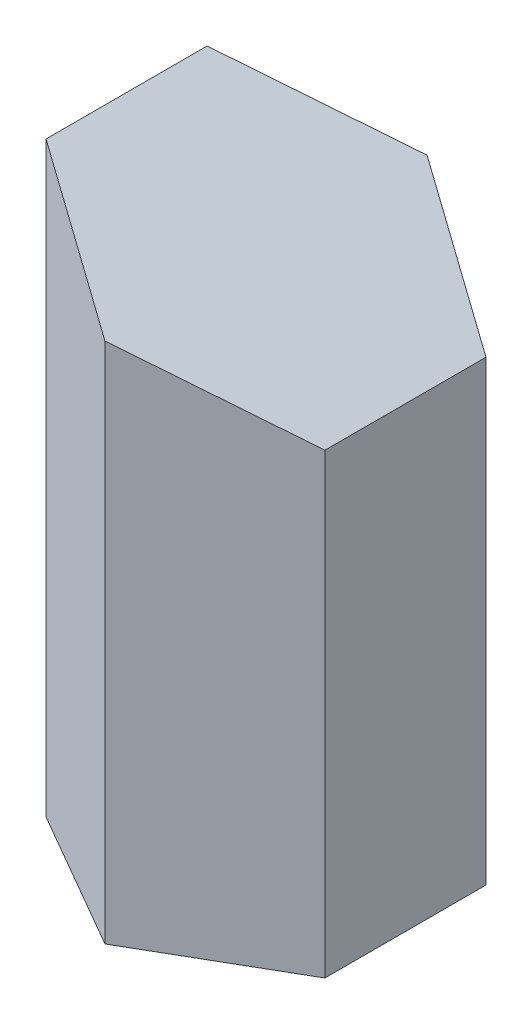
ISO-10303-21;
HEADER;
FILE_DESCRIPTION(('STEP AP214'),'2;1');
FILE_NAME('part.step','',(''),(''),'','','');
FILE_SCHEMA(('AUTOMOTIVE_DESIGN { 1 0 10303 214 1 1 1 1 }'));
ENDSEC;
DATA;
#1=APPLICATION_CONTEXT('core data for automotive mechanical design processes');
#2=APPLICATION_PROTOCOL_DEFINITION('international standard','automotive_design',2000,#1);
#3=PRODUCT_CONTEXT('',#1,'mechanical');
#4=PRODUCT('Part','Part','',(#3));
#5=PRODUCT_RELATED_PRODUCT_CATEGORY('part','',(#4));
#6=PRODUCT_DEFINITION_FORMATION('','',#4);
#7=PRODUCT_DEFINITION_CONTEXT('part definition',#1,'design');
#8=PRODUCT_DEFINITION('design','',#6,#7);
#9=PRODUCT_DEFINITION_SHAPE('','',#8);
#10=(LENGTH_UNIT() NAMED_UNIT(*) SI_UNIT(.MILLI.,.METRE.));
#11=(NAMED_UNIT(*) PLANE_ANGLE_UNIT() SI_UNIT($,.RADIAN.));
#12=(NAMED_UNIT(*) SI_UNIT($,.STERADIAN.) SOLID_ANGLE_UNIT());
#13=UNCERTAINTY_MEASURE_WITH_UNIT(LENGTH_MEASURE(1.E-05),#10,'distance_accuracy_value','');
#14=(GEOMETRIC_REPRESENTATION_CONTEXT(3) GLOBAL_UNCERTAINTY_ASSIGNED_CONTEXT((#13)) GLOBAL_UNIT_ASSIGNED_CONTEXT((#10,
#11,#12)) REPRESENTATION_CONTEXT('',''));
#15=CARTESIAN_POINT('',(0.,0.,0.));
#16=DIRECTION('',(0.,0.,1.));
#17=DIRECTION('',(1.,0.,0.));
#18=AXIS2_PLACEMENT_3D('',#15,#16,#17);
#19=CARTESIAN_POINT('',(-9.49999999999994,40.,5.48482755730156));
#20=DIRECTION('',(0.499999999999995,0.,-0.866025403784442));
#21=DIRECTION('',(-0.866025403784442,0.,-0.499999999999995));
#22=AXIS2_PLACEMENT_3D('',#19,#20,#21);
#23=PLANE('',#22);
#24=DIRECTION('',(0.,-1.,0.));
#25=VECTOR('',#24,1.);
#26=CARTESIAN_POINT('',(0.,40.,10.9696551146029));
#27=LINE('',#26,#25);
#28=CARTESIAN_POINT('',(0.,35.5700772475275,10.9696551146029));
#29=VERTEX_POINT('',#28);
#30=CARTESIAN_POINT('',(0.,0.,10.9696551146029));
#31=VERTEX_POINT('',#30);
#32=EDGE_CURVE('E46',#29,#31,#27,.T.);
#33=ORIENTED_EDGE('',*,*,#32,.F.);
#34=DIRECTION('',(-0.803018297611856,0.374453581814999,-0.463622830290394));
#35=VECTOR('',#34,1.);
#36=CARTESIAN_POINT('',(-9.49999999999994,40.,5.48482755730156));
#37=LINE('',#36,#35);
#38=CARTESIAN_POINT('',(-9.49999999999994,40.,5.48482755730155));
#39=VERTEX_POINT('',#38);
#40=EDGE_CURVE('E134',#29,#39,#37,.T.);
#41=ORIENTED_EDGE('',*,*,#40,.T.);
#42=DIRECTION('',(0.,-1.,0.));
#43=VECTOR('',#42,1.);
#44=CARTESIAN_POINT('',(-9.49999999999994,40.,5.48482755730156));
#45=LINE('',#44,#43);
#46=CARTESIAN_POINT('',(-9.49999999999994,0.,5.48482755730156));
#47=VERTEX_POINT('',#46);
#48=EDGE_CURVE('E128',#39,#47,#45,.T.);
#49=ORIENTED_EDGE('',*,*,#48,.T.);
#50=DIRECTION('',(0.866025403784441,0.,0.499999999999995));
#51=VECTOR('',#50,1.);
#52=CARTESIAN_POINT('',(-9.49999999999994,0.,5.48482755730156));
#53=LINE('',#52,#51);
#54=EDGE_CURVE('E126',#47,#31,#53,.T.);
#55=ORIENTED_EDGE('',*,*,#54,.T.);
#56=EDGE_LOOP('',(#33,#41,#49,#55));
#57=FACE_BOUND('',#56,.T.);
#58=ADVANCED_FACE('F39',(#57),#23,.F.);
#59=CARTESIAN_POINT('',(0.,40.,10.9696551146029));
#60=DIRECTION('',(-0.500000000000001,0.,-0.866025403784438));
#61=DIRECTION('',(-0.866025403784438,0.,0.500000000000001));
#62=AXIS2_PLACEMENT_3D('',#59,#60,#61);
#63=PLANE('',#62);
#64=DIRECTION('',(0.,-1.,0.));
#65=VECTOR('',#64,1.);
#66=CARTESIAN_POINT('',(9.50000000000001,40.,5.48482755730142));
#67=LINE('',#66,#65);
#68=CARTESIAN_POINT('',(9.50000000000001,31.140154495055,5.48482755730142));
#69=VERTEX_POINT('',#68);
#70=CARTESIAN_POINT('',(9.50000000000001,0.,5.48482755730142));
#71=VERTEX_POINT('',#70);
#72=EDGE_CURVE('E109',#69,#71,#67,.T.);
#73=ORIENTED_EDGE('',*,*,#72,.F.);
#74=DIRECTION('',(-0.803018297611853,0.374453581814997,0.4636228302904));
#75=VECTOR('',#74,1.);
#76=CARTESIAN_POINT('',(-1.33204710687376,36.191221014486,11.7387128703297));
#77=LINE('',#76,#75);
#78=EDGE_CURVE('E91',#69,#29,#77,.T.);
#79=ORIENTED_EDGE('',*,*,#78,.T.);
#80=ORIENTED_EDGE('',*,*,#32,.T.);
#81=DIRECTION('',(0.866025403784438,0.,-0.500000000000001));
#82=VECTOR('',#81,1.);
#83=CARTESIAN_POINT('',(0.,0.,10.9696551146029));
#84=LINE('',#83,#82);
#85=EDGE_CURVE('E124',#31,#71,#84,.T.);
#86=ORIENTED_EDGE('',*,*,#85,.T.);
#87=EDGE_LOOP('',(#73,#79,#80,#86));
#88=FACE_BOUND('',#87,.T.);
#89=ADVANCED_FACE('F117',(#88),#63,.F.);
#90=CARTESIAN_POINT('',(9.50000000000001,40.,5.48482755730142));
#91=DIRECTION('',(-1.,0.,0.));
#92=DIRECTION('',(0.,0.,1.));
#93=AXIS2_PLACEMENT_3D('',#90,#91,#92);
#94=PLANE('',#93);
#95=DIRECTION('',(0.,-1.,0.));
#96=VECTOR('',#95,1.);
#97=CARTESIAN_POINT('',(9.49999999999998,40.,-5.48482755730149));
#98=LINE('',#97,#96);
#99=CARTESIAN_POINT('',(9.50000000000001,31.140154495055,-5.48482755730147));
#100=VERTEX_POINT('',#99);
#101=CARTESIAN_POINT('',(9.49999999999998,0.,-5.48482755730149));
#102=VERTEX_POINT('',#101);
#103=EDGE_CURVE('E105',#100,#102,#98,.T.);
#104=ORIENTED_EDGE('',*,*,#103,.F.);
#105=DIRECTION('',(0.,0.,1.));
#106=VECTOR('',#105,1.);
#107=CARTESIAN_POINT('',(9.50000000000001,31.140154495055,-10.9696551146029));
#108=LINE('',#107,#106);
#109=EDGE_CURVE('E89',#100,#69,#108,.T.);
#110=ORIENTED_EDGE('',*,*,#109,.T.);
#111=ORIENTED_EDGE('',*,*,#72,.T.);
#112=DIRECTION('',(0.,0.,-1.));
#113=VECTOR('',#112,1.);
#114=CARTESIAN_POINT('',(9.50000000000001,0.,5.48482755730142));
#115=LINE('',#114,#113);
#116=EDGE_CURVE('E107',#71,#102,#115,.T.);
#117=ORIENTED_EDGE('',*,*,#116,.T.);
#118=EDGE_LOOP('',(#104,#110,#111,#117));
#119=FACE_BOUND('',#118,.T.);
#120=ADVANCED_FACE('F106',(#119),#94,.F.);
#121=CARTESIAN_POINT('',(9.49999999999998,40.,-5.48482755730149));
#122=DIRECTION('',(-0.499999999999995,0.,0.866025403784442));
#123=DIRECTION('',(0.866025403784442,0.,0.499999999999995));
#124=AXIS2_PLACEMENT_3D('',#121,#122,#123);
#125=PLANE('',#124);
#126=DIRECTION('',(0.,-1.,0.));
#127=VECTOR('',#126,1.);
#128=CARTESIAN_POINT('',(0.,40.,-10.9696551146029));
#129=LINE('',#128,#127);
#130=CARTESIAN_POINT('',(0.,35.5700772475276,-10.9696551146029));
#131=VERTEX_POINT('',#130);
#132=CARTESIAN_POINT('',(0.,0.,-10.9696551146029));
#133=VERTEX_POINT('',#132);
#134=EDGE_CURVE('E102',#131,#133,#129,.T.);
#135=ORIENTED_EDGE('',*,*,#134,.F.);
#136=DIRECTION('',(0.803018297611856,-0.374453581814999,0.463622830290394));
#137=VECTOR('',#136,1.);
#138=CARTESIAN_POINT('',(6.83590578625243,32.382442028972,-7.02294306875514));
#139=LINE('',#138,#137);
#140=EDGE_CURVE('E52',#131,#100,#139,.T.);
#141=ORIENTED_EDGE('',*,*,#140,.T.);
#142=ORIENTED_EDGE('',*,*,#103,.T.);
#143=DIRECTION('',(-0.866025403784442,0.,-0.499999999999995));
#144=VECTOR('',#143,1.);
#145=CARTESIAN_POINT('',(9.49999999999998,0.,-5.48482755730149));
#146=LINE('',#145,#144);
#147=EDGE_CURVE('E140',#102,#133,#146,.T.);
#148=ORIENTED_EDGE('',*,*,#147,.T.);
#149=EDGE_LOOP('',(#135,#141,#142,#148));
#150=FACE_BOUND('',#149,.T.);
#151=ADVANCED_FACE('F99',(#150),#125,.F.);
#152=CARTESIAN_POINT('',(0.,40.,-10.9696551146029));
#153=DIRECTION('',(0.500000000000007,0.,0.866025403784435));
#154=DIRECTION('',(0.866025403784435,0.,-0.500000000000007));
#155=AXIS2_PLACEMENT_3D('',#152,#153,#154);
#156=PLANE('',#155);
#157=DIRECTION('',(0.,-1.,0.));
#158=VECTOR('',#157,1.);
#159=CARTESIAN_POINT('',(-9.50000000000005,40.,-5.48482755730136));
#160=LINE('',#159,#158);
#161=CARTESIAN_POINT('',(-9.49999999999993,40.,-5.48482755730142));
#162=VERTEX_POINT('',#161);
#163=CARTESIAN_POINT('',(-9.50000000000005,0.,-5.48482755730136));
#164=VERTEX_POINT('',#163);
#165=EDGE_CURVE('E114',#162,#164,#160,.T.);
#166=ORIENTED_EDGE('',*,*,#165,.F.);
#167=DIRECTION('',(0.80301829761185,-0.374453581814996,-0.463622830290405));
#168=VECTOR('',#167,1.);
#169=CARTESIAN_POINT('',(-1.33204710687382,36.191221014486,-10.2005973588761));
#170=LINE('',#169,#168);
#171=EDGE_CURVE('E11',#162,#131,#170,.T.);
#172=ORIENTED_EDGE('',*,*,#171,.T.);
#173=ORIENTED_EDGE('',*,*,#134,.T.);
#174=DIRECTION('',(-0.866025403784435,0.,0.500000000000007));
#175=VECTOR('',#174,1.);
#176=CARTESIAN_POINT('',(0.,0.,-10.9696551146029));
#177=LINE('',#176,#175);
#178=EDGE_CURVE('E137',#133,#164,#177,.T.);
#179=ORIENTED_EDGE('',*,*,#178,.T.);
#180=EDGE_LOOP('',(#166,#172,#173,#179));
#181=FACE_BOUND('',#180,.T.);
#182=ADVANCED_FACE('F146',(#181),#156,.F.);
#183=CARTESIAN_POINT('',(-9.50000000000005,40.,-5.48482755730136));
#184=DIRECTION('',(1.,0.,0.));
#185=DIRECTION('',(0.,0.,-1.));
#186=AXIS2_PLACEMENT_3D('',#183,#184,#185);
#187=PLANE('',#186);
#188=DIRECTION('',(0.,0.,1.));
#189=VECTOR('',#188,1.);
#190=CARTESIAN_POINT('',(-9.50000000000005,0.,-5.48482755730136));
#191=LINE('',#190,#189);
#192=EDGE_CURVE('E58',#164,#47,#191,.T.);
#193=ORIENTED_EDGE('',*,*,#192,.T.);
#194=ORIENTED_EDGE('',*,*,#48,.F.);
#195=DIRECTION('',(0.,0.,1.));
#196=VECTOR('',#195,1.);
#197=CARTESIAN_POINT('',(-9.50000000000005,40.,-5.48482755730136));
#198=LINE('',#197,#196);
#199=EDGE_CURVE('E132',#162,#39,#198,.T.);
#200=ORIENTED_EDGE('',*,*,#199,.F.);
#201=ORIENTED_EDGE('',*,*,#165,.T.);
#202=EDGE_LOOP('',(#193,#194,#200,#201));
#203=FACE_BOUND('',#202,.T.);
#204=ADVANCED_FACE('F144',(#203),#187,.F.);
#205=CARTESIAN_POINT('',(0.,0.,0.));
#206=DIRECTION('',(0.,1.,0.));
#207=DIRECTION('',(0.,0.,1.));
#208=AXIS2_PLACEMENT_3D('',#205,#206,#207);
#209=PLANE('',#208);
#210=ORIENTED_EDGE('',*,*,#54,.F.);
#211=ORIENTED_EDGE('',*,*,#192,.F.);
#212=ORIENTED_EDGE('',*,*,#178,.F.);
#213=ORIENTED_EDGE('',*,*,#147,.F.);
#214=ORIENTED_EDGE('',*,*,#116,.F.);
#215=ORIENTED_EDGE('',*,*,#85,.F.);
#216=EDGE_LOOP('',(#210,#211,#212,#213,#214,#215));
#217=FACE_BOUND('',#216,.T.);
#218=ADVANCED_FACE('F130',(#217),#209,.F.);
#219=CARTESIAN_POINT('',(-9.49999999999994,40.,-10.9696551146029));
#220=DIRECTION('',(-0.4226182617407,-0.90630778703665,0.));
#221=DIRECTION('',(0.90630778703665,-0.4226182617407,0.));
#222=AXIS2_PLACEMENT_3D('',#219,#220,#221);
#223=PLANE('',#222);
#224=ORIENTED_EDGE('',*,*,#78,.F.);
#225=ORIENTED_EDGE('',*,*,#109,.F.);
#226=ORIENTED_EDGE('',*,*,#140,.F.);
#227=ORIENTED_EDGE('',*,*,#171,.F.);
#228=ORIENTED_EDGE('',*,*,#199,.T.);
#229=ORIENTED_EDGE('',*,*,#40,.F.);
#230=EDGE_LOOP('',(#224,#225,#226,#227,#228,#229));
#231=FACE_BOUND('',#230,.T.);
#232=ADVANCED_FACE('F93',(#231),#223,.F.);
#233=CLOSED_SHELL('',(#58,#89,#120,#151,#182,#204,#218,#232));
#234=MANIFOLD_SOLID_BREP('B2',#233);
#235=ADVANCED_BREP_SHAPE_REPRESENTATION('',(#18,#234),#14);
#236=SHAPE_DEFINITION_REPRESENTATION(#9,#235);
ENDSEC;
END-ISO-10303-21;
